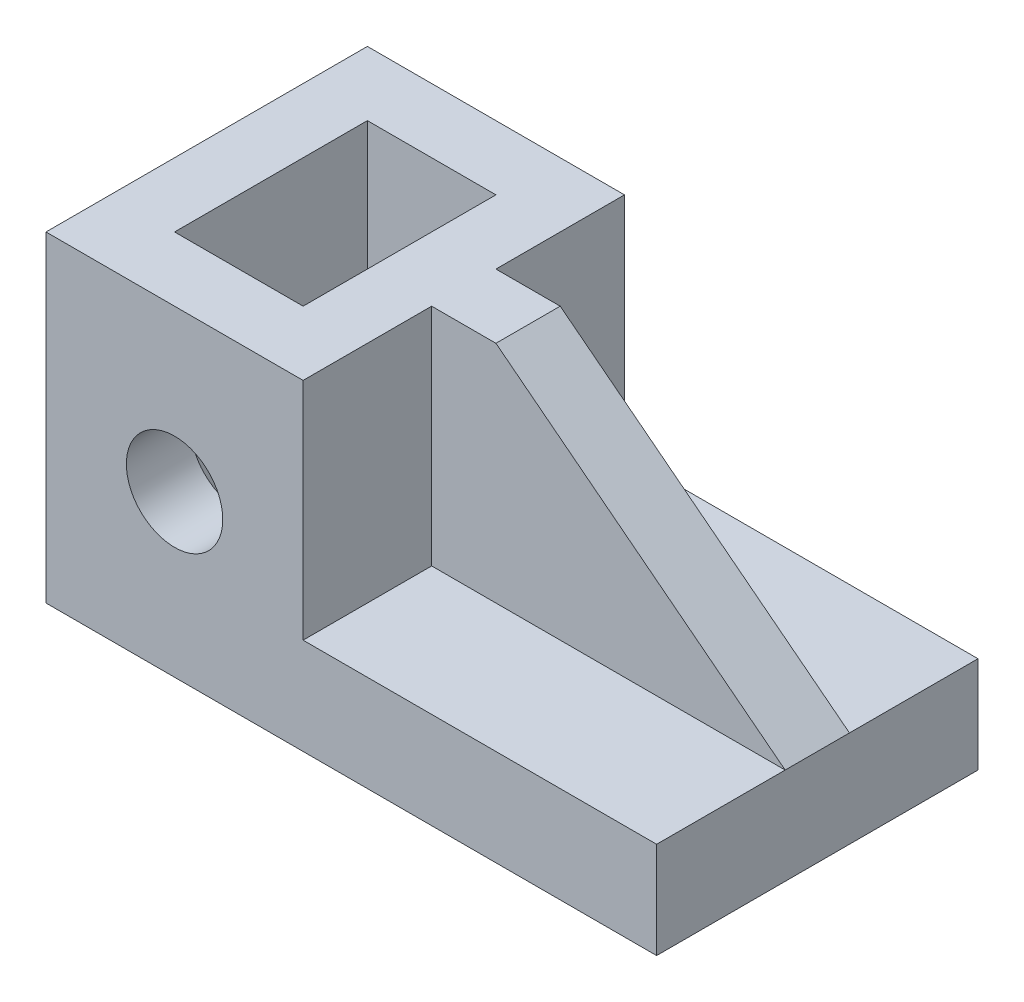
ISO-10303-21;
HEADER;
FILE_DESCRIPTION(('STEP AP214'),'2;1');
FILE_NAME('part.step','',(''),(''),'','','');
FILE_SCHEMA(('AUTOMOTIVE_DESIGN { 1 0 10303 214 1 1 1 1 }'));
ENDSEC;
DATA;
#1=APPLICATION_CONTEXT('core data for automotive mechanical design processes');
#2=APPLICATION_PROTOCOL_DEFINITION('international standard','automotive_design',2000,#1);
#3=PRODUCT_CONTEXT('',#1,'mechanical');
#4=PRODUCT('Part','Part','',(#3));
#5=PRODUCT_RELATED_PRODUCT_CATEGORY('part','',(#4));
#6=PRODUCT_DEFINITION_FORMATION('','',#4);
#7=PRODUCT_DEFINITION_CONTEXT('part definition',#1,'design');
#8=PRODUCT_DEFINITION('design','',#6,#7);
#9=PRODUCT_DEFINITION_SHAPE('','',#8);
#10=(LENGTH_UNIT() NAMED_UNIT(*) SI_UNIT(.MILLI.,.METRE.));
#11=(NAMED_UNIT(*) PLANE_ANGLE_UNIT() SI_UNIT($,.RADIAN.));
#12=(NAMED_UNIT(*) SI_UNIT($,.STERADIAN.) SOLID_ANGLE_UNIT());
#13=UNCERTAINTY_MEASURE_WITH_UNIT(LENGTH_MEASURE(1.E-05),#10,'distance_accuracy_value','');
#14=(GEOMETRIC_REPRESENTATION_CONTEXT(3) GLOBAL_UNCERTAINTY_ASSIGNED_CONTEXT((#13)) GLOBAL_UNIT_ASSIGNED_CONTEXT((#10,
#11,#12)) REPRESENTATION_CONTEXT('',''));
#15=CARTESIAN_POINT('',(0.,0.,0.));
#16=DIRECTION('',(0.,0.,1.));
#17=DIRECTION('',(1.,0.,0.));
#18=AXIS2_PLACEMENT_3D('',#15,#16,#17);
#19=CARTESIAN_POINT('',(-7.5,-10.,-50.));
#20=DIRECTION('',(0.,1.,0.));
#21=DIRECTION('',(0.,0.,1.));
#22=AXIS2_PLACEMENT_3D('',#19,#20,#21);
#23=PLANE('',#22);
#24=DIRECTION('',(0.,0.,1.));
#25=VECTOR('',#24,1.);
#26=CARTESIAN_POINT('',(47.5,-10.,-50.));
#27=LINE('',#26,#25);
#28=CARTESIAN_POINT('',(47.5,-10.,-20.));
#29=VERTEX_POINT('',#28);
#30=CARTESIAN_POINT('',(47.5,-10.,0.));
#31=VERTEX_POINT('',#30);
#32=EDGE_CURVE('E180',#29,#31,#27,.T.);
#33=ORIENTED_EDGE('',*,*,#32,.F.);
#34=DIRECTION('',(-1.,0.,0.));
#35=VECTOR('',#34,1.);
#36=CARTESIAN_POINT('',(-7.5,-10.,-20.));
#37=LINE('',#36,#35);
#38=CARTESIAN_POINT('',(-7.5,-10.,-20.));
#39=VERTEX_POINT('',#38);
#40=EDGE_CURVE('E11',#29,#39,#37,.T.);
#41=ORIENTED_EDGE('',*,*,#40,.T.);
#42=DIRECTION('',(0.,0.,1.));
#43=VECTOR('',#42,1.);
#44=CARTESIAN_POINT('',(-7.5,-10.,-50.));
#45=LINE('',#44,#43);
#46=CARTESIAN_POINT('',(-7.5,-10.,0.));
#47=VERTEX_POINT('',#46);
#48=EDGE_CURVE('E179',#39,#47,#45,.T.);
#49=ORIENTED_EDGE('',*,*,#48,.T.);
#50=DIRECTION('',(-1.,0.,0.));
#51=VECTOR('',#50,1.);
#52=CARTESIAN_POINT('',(-7.5,-10.,0.));
#53=LINE('',#52,#51);
#54=EDGE_CURVE('E279',#31,#47,#53,.T.);
#55=ORIENTED_EDGE('',*,*,#54,.F.);
#56=EDGE_LOOP('',(#33,#41,#49,#55));
#57=FACE_BOUND('',#56,.T.);
#58=ADVANCED_FACE('F43',(#57),#23,.T.);
#59=CARTESIAN_POINT('',(-7.5,25.,-50.));
#60=DIRECTION('',(1.,0.,0.));
#61=DIRECTION('',(0.,0.,-1.));
#62=AXIS2_PLACEMENT_3D('',#59,#60,#61);
#63=PLANE('',#62);
#64=ORIENTED_EDGE('',*,*,#48,.F.);
#65=DIRECTION('',(0.,1.,0.));
#66=VECTOR('',#65,1.);
#67=CARTESIAN_POINT('',(-7.5,-15.,-20.));
#68=LINE('',#67,#66);
#69=CARTESIAN_POINT('',(-7.5,25.,-20.));
#70=VERTEX_POINT('',#69);
#71=EDGE_CURVE('E64',#39,#70,#68,.T.);
#72=ORIENTED_EDGE('',*,*,#71,.T.);
#73=DIRECTION('',(0.,0.,1.));
#74=VECTOR('',#73,1.);
#75=CARTESIAN_POINT('',(-7.5,25.,-50.));
#76=LINE('',#75,#74);
#77=CARTESIAN_POINT('',(-7.5,25.,0.));
#78=VERTEX_POINT('',#77);
#79=EDGE_CURVE('E307',#70,#78,#76,.T.);
#80=ORIENTED_EDGE('',*,*,#79,.T.);
#81=DIRECTION('',(0.,1.,0.));
#82=VECTOR('',#81,1.);
#83=CARTESIAN_POINT('',(-7.5,25.,0.));
#84=LINE('',#83,#82);
#85=EDGE_CURVE('E283',#47,#78,#84,.T.);
#86=ORIENTED_EDGE('',*,*,#85,.F.);
#87=EDGE_LOOP('',(#64,#72,#80,#86));
#88=FACE_BOUND('',#87,.T.);
#89=ADVANCED_FACE('F313',(#88),#63,.T.);
#90=DIRECTION('',(-1.,0.,0.));
#91=VECTOR('',#90,1.);
#92=CARTESIAN_POINT('',(-7.5,-10.,-30.));
#93=LINE('',#92,#91);
#94=CARTESIAN_POINT('',(47.5,-10.,-30.));
#95=VERTEX_POINT('',#94);
#96=CARTESIAN_POINT('',(-7.5,-10.,-30.));
#97=VERTEX_POINT('',#96);
#98=EDGE_CURVE('E52',#95,#97,#93,.T.);
#99=ORIENTED_EDGE('',*,*,#98,.F.);
#100=CARTESIAN_POINT('',(47.5,-10.,-50.));
#101=VERTEX_POINT('',#100);
#102=EDGE_CURVE('E146',#101,#95,#27,.T.);
#103=ORIENTED_EDGE('',*,*,#102,.F.);
#104=DIRECTION('',(-1.,0.,0.));
#105=VECTOR('',#104,1.);
#106=CARTESIAN_POINT('',(-7.5,-10.,-50.));
#107=LINE('',#106,#105);
#108=CARTESIAN_POINT('',(-7.5,-10.,-50.));
#109=VERTEX_POINT('',#108);
#110=EDGE_CURVE('E257',#101,#109,#107,.T.);
#111=ORIENTED_EDGE('',*,*,#110,.T.);
#112=EDGE_CURVE('E148',#109,#97,#45,.T.);
#113=ORIENTED_EDGE('',*,*,#112,.T.);
#114=EDGE_LOOP('',(#99,#103,#111,#113));
#115=FACE_BOUND('',#114,.T.);
#116=ADVANCED_FACE('F143',(#115),#23,.T.);
#117=CARTESIAN_POINT('',(47.5,-10.,-50.));
#118=DIRECTION('',(1.,0.,0.));
#119=DIRECTION('',(0.,1.,0.));
#120=AXIS2_PLACEMENT_3D('',#117,#118,#119);
#121=PLANE('',#120);
#122=DIRECTION('',(0.,1.,0.));
#123=VECTOR('',#122,1.);
#124=CARTESIAN_POINT('',(47.5,-10.,0.));
#125=LINE('',#124,#123);
#126=CARTESIAN_POINT('',(47.5,-25.,0.));
#127=VERTEX_POINT('',#126);
#128=EDGE_CURVE('E245',#127,#31,#125,.T.);
#129=ORIENTED_EDGE('',*,*,#128,.F.);
#130=DIRECTION('',(0.,0.,1.));
#131=VECTOR('',#130,1.);
#132=CARTESIAN_POINT('',(47.5,-25.,-50.));
#133=LINE('',#132,#131);
#134=CARTESIAN_POINT('',(47.5,-25.,-50.));
#135=VERTEX_POINT('',#134);
#136=EDGE_CURVE('E153',#135,#127,#133,.T.);
#137=ORIENTED_EDGE('',*,*,#136,.F.);
#138=DIRECTION('',(0.,1.,0.));
#139=VECTOR('',#138,1.);
#140=CARTESIAN_POINT('',(47.5,-10.,-50.));
#141=LINE('',#140,#139);
#142=EDGE_CURVE('E177',#135,#101,#141,.T.);
#143=ORIENTED_EDGE('',*,*,#142,.T.);
#144=ORIENTED_EDGE('',*,*,#102,.T.);
#145=DIRECTION('',(0.,0.,1.));
#146=VECTOR('',#145,1.);
#147=CARTESIAN_POINT('',(47.5,-10.,-30.));
#148=LINE('',#147,#146);
#149=EDGE_CURVE('E164',#95,#29,#148,.T.);
#150=ORIENTED_EDGE('',*,*,#149,.T.);
#151=ORIENTED_EDGE('',*,*,#32,.T.);
#152=EDGE_LOOP('',(#129,#137,#143,#144,#150,#151));
#153=FACE_BOUND('',#152,.T.);
#154=ADVANCED_FACE('F45',(#153),#121,.T.);
#155=CARTESIAN_POINT('',(-47.5,-25.,-50.));
#156=DIRECTION('',(0.,-1.,0.));
#157=DIRECTION('',(0.,0.,-1.));
#158=AXIS2_PLACEMENT_3D('',#155,#156,#157);
#159=PLANE('',#158);
#160=DIRECTION('',(0.,0.,-1.));
#161=VECTOR('',#160,1.);
#162=CARTESIAN_POINT('',(-17.5,-25.,-40.));
#163=LINE('',#162,#161);
#164=CARTESIAN_POINT('',(-17.5,-25.,-10.));
#165=VERTEX_POINT('',#164);
#166=CARTESIAN_POINT('',(-17.5,-25.,-40.));
#167=VERTEX_POINT('',#166);
#168=EDGE_CURVE('E211',#165,#167,#163,.T.);
#169=ORIENTED_EDGE('',*,*,#168,.T.);
#170=DIRECTION('',(-1.,0.,0.));
#171=VECTOR('',#170,1.);
#172=CARTESIAN_POINT('',(-37.5,-25.,-40.));
#173=LINE('',#172,#171);
#174=CARTESIAN_POINT('',(-37.5,-25.,-40.));
#175=VERTEX_POINT('',#174);
#176=EDGE_CURVE('E215',#167,#175,#173,.T.);
#177=ORIENTED_EDGE('',*,*,#176,.T.);
#178=DIRECTION('',(0.,0.,1.));
#179=VECTOR('',#178,1.);
#180=CARTESIAN_POINT('',(-37.5,-25.,-40.));
#181=LINE('',#180,#179);
#182=CARTESIAN_POINT('',(-37.5,-25.,-10.));
#183=VERTEX_POINT('',#182);
#184=EDGE_CURVE('E220',#175,#183,#181,.T.);
#185=ORIENTED_EDGE('',*,*,#184,.T.);
#186=DIRECTION('',(1.,0.,0.));
#187=VECTOR('',#186,1.);
#188=CARTESIAN_POINT('',(-37.5,-25.,-10.));
#189=LINE('',#188,#187);
#190=EDGE_CURVE('E224',#183,#165,#189,.T.);
#191=ORIENTED_EDGE('',*,*,#190,.T.);
#192=EDGE_LOOP('',(#169,#177,#185,#191));
#193=FACE_BOUND('',#192,.T.);
#194=DIRECTION('',(1.,0.,0.));
#195=VECTOR('',#194,1.);
#196=CARTESIAN_POINT('',(-47.5,-25.,0.));
#197=LINE('',#196,#195);
#198=CARTESIAN_POINT('',(-47.5,-25.,0.));
#199=VERTEX_POINT('',#198);
#200=EDGE_CURVE('E258',#199,#127,#197,.T.);
#201=ORIENTED_EDGE('',*,*,#200,.F.);
#202=DIRECTION('',(0.,0.,1.));
#203=VECTOR('',#202,1.);
#204=CARTESIAN_POINT('',(-47.5,-25.,-50.));
#205=LINE('',#204,#203);
#206=CARTESIAN_POINT('',(-47.5,-25.,-50.));
#207=VERTEX_POINT('',#206);
#208=EDGE_CURVE('E300',#207,#199,#205,.T.);
#209=ORIENTED_EDGE('',*,*,#208,.F.);
#210=DIRECTION('',(1.,0.,0.));
#211=VECTOR('',#210,1.);
#212=CARTESIAN_POINT('',(-47.5,-25.,-50.));
#213=LINE('',#212,#211);
#214=EDGE_CURVE('E185',#207,#135,#213,.T.);
#215=ORIENTED_EDGE('',*,*,#214,.T.);
#216=ORIENTED_EDGE('',*,*,#136,.T.);
#217=EDGE_LOOP('',(#201,#209,#215,#216));
#218=FACE_BOUND('',#217,.T.);
#219=ADVANCED_FACE('F361',(#193,#218),#159,.T.);
#220=CARTESIAN_POINT('',(-47.5,25.,-50.));
#221=DIRECTION('',(-1.,0.,0.));
#222=DIRECTION('',(0.,-1.,0.));
#223=AXIS2_PLACEMENT_3D('',#220,#221,#222);
#224=PLANE('',#223);
#225=DIRECTION('',(0.,-1.,0.));
#226=VECTOR('',#225,1.);
#227=CARTESIAN_POINT('',(-47.5,25.,0.));
#228=LINE('',#227,#226);
#229=CARTESIAN_POINT('',(-47.5,25.,0.));
#230=VERTEX_POINT('',#229);
#231=EDGE_CURVE('E291',#230,#199,#228,.T.);
#232=ORIENTED_EDGE('',*,*,#231,.F.);
#233=DIRECTION('',(0.,0.,1.));
#234=VECTOR('',#233,1.);
#235=CARTESIAN_POINT('',(-47.5,25.,-50.));
#236=LINE('',#235,#234);
#237=CARTESIAN_POINT('',(-47.5,25.,-50.));
#238=VERTEX_POINT('',#237);
#239=EDGE_CURVE('E303',#238,#230,#236,.T.);
#240=ORIENTED_EDGE('',*,*,#239,.F.);
#241=DIRECTION('',(0.,-1.,0.));
#242=VECTOR('',#241,1.);
#243=CARTESIAN_POINT('',(-47.5,25.,-50.));
#244=LINE('',#243,#242);
#245=EDGE_CURVE('E269',#238,#207,#244,.T.);
#246=ORIENTED_EDGE('',*,*,#245,.T.);
#247=ORIENTED_EDGE('',*,*,#208,.T.);
#248=EDGE_LOOP('',(#232,#240,#246,#247));
#249=FACE_BOUND('',#248,.T.);
#250=ADVANCED_FACE('F350',(#249),#224,.T.);
#251=CARTESIAN_POINT('',(-47.5,25.,-50.));
#252=DIRECTION('',(0.,1.,0.));
#253=DIRECTION('',(0.,0.,1.));
#254=AXIS2_PLACEMENT_3D('',#251,#252,#253);
#255=PLANE('',#254);
#256=DIRECTION('',(0.,0.,-1.));
#257=VECTOR('',#256,1.);
#258=CARTESIAN_POINT('',(-17.5,25.,-40.));
#259=LINE('',#258,#257);
#260=CARTESIAN_POINT('',(-17.5,25.,-10.));
#261=VERTEX_POINT('',#260);
#262=CARTESIAN_POINT('',(-17.5,25.,-40.));
#263=VERTEX_POINT('',#262);
#264=EDGE_CURVE('E198',#261,#263,#259,.T.);
#265=ORIENTED_EDGE('',*,*,#264,.F.);
#266=DIRECTION('',(1.,0.,0.));
#267=VECTOR('',#266,1.);
#268=CARTESIAN_POINT('',(-37.5,25.,-10.));
#269=LINE('',#268,#267);
#270=CARTESIAN_POINT('',(-37.5,25.,-10.));
#271=VERTEX_POINT('',#270);
#272=EDGE_CURVE('E216',#271,#261,#269,.T.);
#273=ORIENTED_EDGE('',*,*,#272,.F.);
#274=DIRECTION('',(0.,0.,1.));
#275=VECTOR('',#274,1.);
#276=CARTESIAN_POINT('',(-37.5,25.,-40.));
#277=LINE('',#276,#275);
#278=CARTESIAN_POINT('',(-37.5,25.,-40.));
#279=VERTEX_POINT('',#278);
#280=EDGE_CURVE('E235',#279,#271,#277,.T.);
#281=ORIENTED_EDGE('',*,*,#280,.F.);
#282=DIRECTION('',(-1.,0.,0.));
#283=VECTOR('',#282,1.);
#284=CARTESIAN_POINT('',(-37.5,25.,-40.));
#285=LINE('',#284,#283);
#286=EDGE_CURVE('E231',#263,#279,#285,.T.);
#287=ORIENTED_EDGE('',*,*,#286,.F.);
#288=EDGE_LOOP('',(#265,#273,#281,#287));
#289=FACE_BOUND('',#288,.T.);
#290=DIRECTION('',(-1.,0.,0.));
#291=VECTOR('',#290,1.);
#292=CARTESIAN_POINT('',(-47.5,25.,0.));
#293=LINE('',#292,#291);
#294=EDGE_CURVE('E287',#78,#230,#293,.T.);
#295=ORIENTED_EDGE('',*,*,#294,.F.);
#296=ORIENTED_EDGE('',*,*,#79,.F.);
#297=DIRECTION('',(-1.,0.,0.));
#298=VECTOR('',#297,1.);
#299=CARTESIAN_POINT('',(2.5,25.,-20.));
#300=LINE('',#299,#298);
#301=CARTESIAN_POINT('',(2.5,25.,-20.));
#302=VERTEX_POINT('',#301);
#303=EDGE_CURVE('E324',#302,#70,#300,.T.);
#304=ORIENTED_EDGE('',*,*,#303,.F.);
#305=DIRECTION('',(0.,0.,1.));
#306=VECTOR('',#305,1.);
#307=CARTESIAN_POINT('',(2.5,25.,-30.));
#308=LINE('',#307,#306);
#309=CARTESIAN_POINT('',(2.5,25.,-30.));
#310=VERTEX_POINT('',#309);
#311=EDGE_CURVE('E172',#310,#302,#308,.T.);
#312=ORIENTED_EDGE('',*,*,#311,.F.);
#313=DIRECTION('',(-1.,0.,0.));
#314=VECTOR('',#313,1.);
#315=CARTESIAN_POINT('',(2.5,25.,-30.));
#316=LINE('',#315,#314);
#317=CARTESIAN_POINT('',(-7.5,25.,-30.));
#318=VERTEX_POINT('',#317);
#319=EDGE_CURVE('E159',#310,#318,#316,.T.);
#320=ORIENTED_EDGE('',*,*,#319,.T.);
#321=CARTESIAN_POINT('',(-7.5,25.,-50.));
#322=VERTEX_POINT('',#321);
#323=EDGE_CURVE('E305',#322,#318,#76,.T.);
#324=ORIENTED_EDGE('',*,*,#323,.F.);
#325=DIRECTION('',(-1.,0.,0.));
#326=VECTOR('',#325,1.);
#327=CARTESIAN_POINT('',(-47.5,25.,-50.));
#328=LINE('',#327,#326);
#329=EDGE_CURVE('E265',#322,#238,#328,.T.);
#330=ORIENTED_EDGE('',*,*,#329,.T.);
#331=ORIENTED_EDGE('',*,*,#239,.T.);
#332=EDGE_LOOP('',(#295,#296,#304,#312,#320,#324,#330,#331));
#333=FACE_BOUND('',#332,.T.);
#334=ADVANCED_FACE('F317',(#289,#333),#255,.T.);
#335=DIRECTION('',(0.,1.,0.));
#336=VECTOR('',#335,1.);
#337=CARTESIAN_POINT('',(-7.5,-15.,-30.));
#338=LINE('',#337,#336);
#339=EDGE_CURVE('E326',#97,#318,#338,.T.);
#340=ORIENTED_EDGE('',*,*,#339,.F.);
#341=ORIENTED_EDGE('',*,*,#112,.F.);
#342=DIRECTION('',(0.,1.,0.));
#343=VECTOR('',#342,1.);
#344=CARTESIAN_POINT('',(-7.5,25.,-50.));
#345=LINE('',#344,#343);
#346=EDGE_CURVE('E261',#109,#322,#345,.T.);
#347=ORIENTED_EDGE('',*,*,#346,.T.);
#348=ORIENTED_EDGE('',*,*,#323,.T.);
#349=EDGE_LOOP('',(#340,#341,#347,#348));
#350=FACE_BOUND('',#349,.T.);
#351=ADVANCED_FACE('F342',(#350),#63,.T.);
#352=CARTESIAN_POINT('',(0.,0.,-50.));
#353=DIRECTION('',(0.,0.,1.));
#354=DIRECTION('',(1.,0.,0.));
#355=AXIS2_PLACEMENT_3D('',#352,#353,#354);
#356=PLANE('',#355);
#357=CARTESIAN_POINT('',(-27.5,0.,-50.));
#358=DIRECTION('',(0.,0.,1.));
#359=DIRECTION('',(1.,0.,0.));
#360=AXIS2_PLACEMENT_3D('',#357,#358,#359);
#361=CIRCLE('',#360,7.5);
#362=CARTESIAN_POINT('',(-20.,0.,-50.));
#363=VERTEX_POINT('',#362);
#364=EDGE_CURVE('E192',#363,#363,#361,.T.);
#365=ORIENTED_EDGE('',*,*,#364,.T.);
#366=EDGE_LOOP('',(#365));
#367=FACE_BOUND('',#366,.T.);
#368=ORIENTED_EDGE('',*,*,#142,.F.);
#369=ORIENTED_EDGE('',*,*,#214,.F.);
#370=ORIENTED_EDGE('',*,*,#245,.F.);
#371=ORIENTED_EDGE('',*,*,#329,.F.);
#372=ORIENTED_EDGE('',*,*,#346,.F.);
#373=ORIENTED_EDGE('',*,*,#110,.F.);
#374=EDGE_LOOP('',(#368,#369,#370,#371,#372,#373));
#375=FACE_BOUND('',#374,.T.);
#376=ADVANCED_FACE('F340',(#367,#375),#356,.F.);
#377=CARTESIAN_POINT('',(0.,0.,0.));
#378=DIRECTION('',(0.,0.,1.));
#379=DIRECTION('',(1.,0.,0.));
#380=AXIS2_PLACEMENT_3D('',#377,#378,#379);
#381=PLANE('',#380);
#382=CARTESIAN_POINT('',(-27.5,0.,0.));
#383=DIRECTION('',(0.,0.,1.));
#384=DIRECTION('',(1.,0.,0.));
#385=AXIS2_PLACEMENT_3D('',#382,#383,#384);
#386=CIRCLE('',#385,7.5);
#387=CARTESIAN_POINT('',(-20.,0.,0.));
#388=VERTEX_POINT('',#387);
#389=EDGE_CURVE('E201',#388,#388,#386,.T.);
#390=ORIENTED_EDGE('',*,*,#389,.F.);
#391=EDGE_LOOP('',(#390));
#392=FACE_BOUND('',#391,.T.);
#393=ORIENTED_EDGE('',*,*,#128,.T.);
#394=ORIENTED_EDGE('',*,*,#54,.T.);
#395=ORIENTED_EDGE('',*,*,#85,.T.);
#396=ORIENTED_EDGE('',*,*,#294,.T.);
#397=ORIENTED_EDGE('',*,*,#231,.T.);
#398=ORIENTED_EDGE('',*,*,#200,.T.);
#399=EDGE_LOOP('',(#393,#394,#395,#396,#397,#398));
#400=FACE_BOUND('',#399,.T.);
#401=ADVANCED_FACE('F320',(#392,#400),#381,.T.);
#402=CARTESIAN_POINT('',(-17.5,-25.,-40.));
#403=DIRECTION('',(1.,0.,0.));
#404=DIRECTION('',(0.,0.,-1.));
#405=AXIS2_PLACEMENT_3D('',#402,#403,#404);
#406=PLANE('',#405);
#407=ORIENTED_EDGE('',*,*,#264,.T.);
#408=DIRECTION('',(0.,1.,0.));
#409=VECTOR('',#408,1.);
#410=CARTESIAN_POINT('',(-17.5,-25.,-40.));
#411=LINE('',#410,#409);
#412=EDGE_CURVE('E228',#167,#263,#411,.T.);
#413=ORIENTED_EDGE('',*,*,#412,.F.);
#414=ORIENTED_EDGE('',*,*,#168,.F.);
#415=DIRECTION('',(0.,1.,0.));
#416=VECTOR('',#415,1.);
#417=CARTESIAN_POINT('',(-17.5,-25.,-10.));
#418=LINE('',#417,#416);
#419=EDGE_CURVE('E242',#165,#261,#418,.T.);
#420=ORIENTED_EDGE('',*,*,#419,.T.);
#421=EDGE_LOOP('',(#407,#413,#414,#420));
#422=FACE_BOUND('',#421,.T.);
#423=ADVANCED_FACE('F375',(#422),#406,.F.);
#424=CARTESIAN_POINT('',(-37.5,-25.,-10.));
#425=DIRECTION('',(0.,0.,1.));
#426=DIRECTION('',(1.,0.,0.));
#427=AXIS2_PLACEMENT_3D('',#424,#425,#426);
#428=PLANE('',#427);
#429=CARTESIAN_POINT('',(-27.5,0.,-10.));
#430=DIRECTION('',(0.,0.,1.));
#431=DIRECTION('',(1.,0.,0.));
#432=AXIS2_PLACEMENT_3D('',#429,#430,#431);
#433=CIRCLE('',#432,7.5);
#434=CARTESIAN_POINT('',(-20.,0.,-10.));
#435=VERTEX_POINT('',#434);
#436=EDGE_CURVE('E191',#435,#435,#433,.T.);
#437=ORIENTED_EDGE('',*,*,#436,.T.);
#438=EDGE_LOOP('',(#437));
#439=FACE_BOUND('',#438,.T.);
#440=ORIENTED_EDGE('',*,*,#272,.T.);
#441=ORIENTED_EDGE('',*,*,#419,.F.);
#442=ORIENTED_EDGE('',*,*,#190,.F.);
#443=DIRECTION('',(0.,1.,0.));
#444=VECTOR('',#443,1.);
#445=CARTESIAN_POINT('',(-37.5,-25.,-10.));
#446=LINE('',#445,#444);
#447=EDGE_CURVE('E246',#183,#271,#446,.T.);
#448=ORIENTED_EDGE('',*,*,#447,.T.);
#449=EDGE_LOOP('',(#440,#441,#442,#448));
#450=FACE_BOUND('',#449,.T.);
#451=ADVANCED_FACE('F380',(#439,#450),#428,.F.);
#452=CARTESIAN_POINT('',(-37.5,-25.,-40.));
#453=DIRECTION('',(-1.,0.,0.));
#454=DIRECTION('',(0.,0.,1.));
#455=AXIS2_PLACEMENT_3D('',#452,#453,#454);
#456=PLANE('',#455);
#457=ORIENTED_EDGE('',*,*,#280,.T.);
#458=ORIENTED_EDGE('',*,*,#447,.F.);
#459=ORIENTED_EDGE('',*,*,#184,.F.);
#460=DIRECTION('',(0.,1.,0.));
#461=VECTOR('',#460,1.);
#462=CARTESIAN_POINT('',(-37.5,-25.,-40.));
#463=LINE('',#462,#461);
#464=EDGE_CURVE('E249',#175,#279,#463,.T.);
#465=ORIENTED_EDGE('',*,*,#464,.T.);
#466=EDGE_LOOP('',(#457,#458,#459,#465));
#467=FACE_BOUND('',#466,.T.);
#468=ADVANCED_FACE('F386',(#467),#456,.F.);
#469=CARTESIAN_POINT('',(-37.5,-25.,-40.));
#470=DIRECTION('',(0.,0.,-1.));
#471=DIRECTION('',(-1.,0.,0.));
#472=AXIS2_PLACEMENT_3D('',#469,#470,#471);
#473=PLANE('',#472);
#474=CARTESIAN_POINT('',(-27.5,0.,-40.));
#475=DIRECTION('',(0.,0.,-1.));
#476=DIRECTION('',(-1.,0.,0.));
#477=AXIS2_PLACEMENT_3D('',#474,#475,#476);
#478=CIRCLE('',#477,7.5);
#479=CARTESIAN_POINT('',(-35.,0.,-40.));
#480=VERTEX_POINT('',#479);
#481=EDGE_CURVE('E188',#480,#480,#478,.T.);
#482=ORIENTED_EDGE('',*,*,#481,.T.);
#483=EDGE_LOOP('',(#482));
#484=FACE_BOUND('',#483,.T.);
#485=ORIENTED_EDGE('',*,*,#286,.T.);
#486=ORIENTED_EDGE('',*,*,#464,.F.);
#487=ORIENTED_EDGE('',*,*,#176,.F.);
#488=ORIENTED_EDGE('',*,*,#412,.T.);
#489=EDGE_LOOP('',(#485,#486,#487,#488));
#490=FACE_BOUND('',#489,.T.);
#491=ADVANCED_FACE('F382',(#484,#490),#473,.F.);
#492=CARTESIAN_POINT('',(-27.5,0.,-50.));
#493=DIRECTION('',(0.,0.,1.));
#494=DIRECTION('',(1.,0.,0.));
#495=AXIS2_PLACEMENT_3D('',#492,#493,#494);
#496=CYLINDRICAL_SURFACE('',#495,7.5);
#497=ORIENTED_EDGE('',*,*,#364,.F.);
#498=EDGE_LOOP('',(#497));
#499=FACE_BOUND('',#498,.T.);
#500=ORIENTED_EDGE('',*,*,#481,.F.);
#501=EDGE_LOOP('',(#500));
#502=FACE_BOUND('',#501,.T.);
#503=ADVANCED_FACE('F385',(#499,#502),#496,.F.);
#504=ORIENTED_EDGE('',*,*,#389,.T.);
#505=EDGE_LOOP('',(#504));
#506=FACE_BOUND('',#505,.T.);
#507=ORIENTED_EDGE('',*,*,#436,.F.);
#508=EDGE_LOOP('',(#507));
#509=FACE_BOUND('',#508,.T.);
#510=ADVANCED_FACE('F393',(#506,#509),#496,.F.);
#511=CARTESIAN_POINT('',(2.5,-15.,-20.));
#512=DIRECTION('',(0.,0.,-1.));
#513=DIRECTION('',(-1.,0.,0.));
#514=AXIS2_PLACEMENT_3D('',#511,#512,#513);
#515=PLANE('',#514);
#516=ORIENTED_EDGE('',*,*,#40,.F.);
#517=DIRECTION('',(0.789352217376326,-0.61394061351492,0.));
#518=VECTOR('',#517,1.);
#519=CARTESIAN_POINT('',(2.5,25.,-20.));
#520=LINE('',#519,#518);
#521=EDGE_CURVE('E165',#302,#29,#520,.T.);
#522=ORIENTED_EDGE('',*,*,#521,.F.);
#523=ORIENTED_EDGE('',*,*,#303,.T.);
#524=ORIENTED_EDGE('',*,*,#71,.F.);
#525=EDGE_LOOP('',(#516,#522,#523,#524));
#526=FACE_BOUND('',#525,.T.);
#527=ADVANCED_FACE('F323',(#526),#515,.F.);
#528=CARTESIAN_POINT('',(2.5,-15.,-30.));
#529=DIRECTION('',(0.,0.,-1.));
#530=DIRECTION('',(-1.,0.,0.));
#531=AXIS2_PLACEMENT_3D('',#528,#529,#530);
#532=PLANE('',#531);
#533=ORIENTED_EDGE('',*,*,#319,.F.);
#534=DIRECTION('',(0.789352217376326,-0.61394061351492,0.));
#535=VECTOR('',#534,1.);
#536=CARTESIAN_POINT('',(2.5,25.,-30.));
#537=LINE('',#536,#535);
#538=EDGE_CURVE('E155',#310,#95,#537,.T.);
#539=ORIENTED_EDGE('',*,*,#538,.T.);
#540=ORIENTED_EDGE('',*,*,#98,.T.);
#541=ORIENTED_EDGE('',*,*,#339,.T.);
#542=EDGE_LOOP('',(#533,#539,#540,#541));
#543=FACE_BOUND('',#542,.T.);
#544=ADVANCED_FACE('F157',(#543),#532,.T.);
#545=CARTESIAN_POINT('',(2.5,25.,-30.));
#546=DIRECTION('',(-0.613940613514921,-0.789352217376326,0.));
#547=DIRECTION('',(0.789352217376326,-0.613940613514921,0.));
#548=AXIS2_PLACEMENT_3D('',#545,#546,#547);
#549=PLANE('',#548);
#550=ORIENTED_EDGE('',*,*,#521,.T.);
#551=ORIENTED_EDGE('',*,*,#149,.F.);
#552=ORIENTED_EDGE('',*,*,#538,.F.);
#553=ORIENTED_EDGE('',*,*,#311,.T.);
#554=EDGE_LOOP('',(#550,#551,#552,#553));
#555=FACE_BOUND('',#554,.T.);
#556=ADVANCED_FACE('F168',(#555),#549,.F.);
#557=CLOSED_SHELL('',(#58,#89,#116,#154,#219,#250,#334,#351,#376,#401,#423,#451,#468,#491,#503,
#510,#527,#544,#556));
#558=MANIFOLD_SOLID_BREP('B2',#557);
#559=ADVANCED_BREP_SHAPE_REPRESENTATION('',(#18,#558),#14);
#560=SHAPE_DEFINITION_REPRESENTATION(#9,#559);
ENDSEC;
END-ISO-10303-21;
